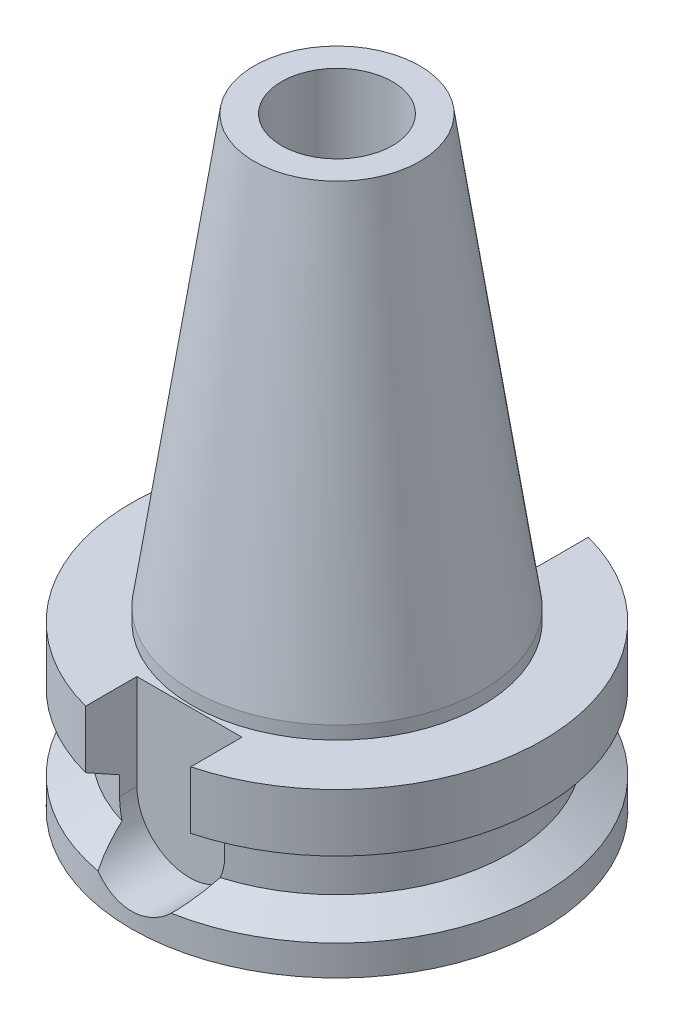
ISO-10303-21;
HEADER;
FILE_DESCRIPTION(('STEP AP214'),'2;1');
FILE_NAME('part.step','',(''),(''),'','','');
FILE_SCHEMA(('AUTOMOTIVE_DESIGN { 1 0 10303 214 1 1 1 1 }'));
ENDSEC;
DATA;
#1=APPLICATION_CONTEXT('core data for automotive mechanical design processes');
#2=APPLICATION_PROTOCOL_DEFINITION('international standard','automotive_design',2000,#1);
#3=PRODUCT_CONTEXT('',#1,'mechanical');
#4=PRODUCT('Part','Part','',(#3));
#5=PRODUCT_RELATED_PRODUCT_CATEGORY('part','',(#4));
#6=PRODUCT_DEFINITION_FORMATION('','',#4);
#7=PRODUCT_DEFINITION_CONTEXT('part definition',#1,'design');
#8=PRODUCT_DEFINITION('design','',#6,#7);
#9=PRODUCT_DEFINITION_SHAPE('','',#8);
#10=(LENGTH_UNIT() NAMED_UNIT(*) SI_UNIT(.MILLI.,.METRE.));
#11=(NAMED_UNIT(*) PLANE_ANGLE_UNIT() SI_UNIT($,.RADIAN.));
#12=(NAMED_UNIT(*) SI_UNIT($,.STERADIAN.) SOLID_ANGLE_UNIT());
#13=UNCERTAINTY_MEASURE_WITH_UNIT(LENGTH_MEASURE(1.E-05),#10,'distance_accuracy_value','');
#14=(GEOMETRIC_REPRESENTATION_CONTEXT(3) GLOBAL_UNCERTAINTY_ASSIGNED_CONTEXT((#13)) GLOBAL_UNIT_ASSIGNED_CONTEXT((#10,
#11,#12)) REPRESENTATION_CONTEXT('',''));
#15=CARTESIAN_POINT('',(0.,0.,0.));
#16=DIRECTION('',(0.,0.,1.));
#17=DIRECTION('',(1.,0.,0.));
#18=AXIS2_PLACEMENT_3D('',#15,#16,#17);
#19=CARTESIAN_POINT('',(0.,0.,0.));
#20=DIRECTION('',(0.,1.,0.));
#21=DIRECTION('',(0.,0.,1.));
#22=AXIS2_PLACEMENT_3D('',#19,#20,#21);
#23=PLANE('',#22);
#24=CARTESIAN_POINT('',(0.,0.,0.));
#25=DIRECTION('',(0.,-1.,0.));
#26=DIRECTION('',(0.,0.,-1.));
#27=AXIS2_PLACEMENT_3D('',#24,#25,#26);
#28=CIRCLE('',#27,31.5);
#29=CARTESIAN_POINT('',(0.,0.,-31.5));
#30=VERTEX_POINT('',#29);
#31=EDGE_CURVE('E19',#30,#30,#28,.F.);
#32=ORIENTED_EDGE('',*,*,#31,.F.);
#33=EDGE_LOOP('',(#32));
#34=FACE_BOUND('',#33,.T.);
#35=ADVANCED_FACE('F16',(#34),#23,.F.);
#36=CARTESIAN_POINT('',(0.,32.3999999999387,0.));
#37=DIRECTION('',(0.,1.,0.));
#38=DIRECTION('',(0.,0.,1.));
#39=AXIS2_PLACEMENT_3D('',#36,#37,#38);
#40=CONICAL_SURFACE('',#39,6.99999999983447,1.02974425861886);
#41=CARTESIAN_POINT('',(0.,28.1939756666248,-1.13686837721616E-10));
#42=VERTEX_POINT('',#41);
#43=VERTEX_LOOP('',#42);
#44=FACE_BOUND('',#43,.T.);
#45=CARTESIAN_POINT('',(0.,32.4,0.));
#46=DIRECTION('',(0.,1.,0.));
#47=DIRECTION('',(0.,0.,1.));
#48=AXIS2_PLACEMENT_3D('',#45,#46,#47);
#49=CIRCLE('',#48,7.);
#50=CARTESIAN_POINT('',(0.,32.4,7.));
#51=VERTEX_POINT('',#50);
#52=EDGE_CURVE('E144',#51,#51,#49,.T.);
#53=ORIENTED_EDGE('',*,*,#52,.T.);
#54=EDGE_LOOP('',(#53));
#55=FACE_BOUND('',#54,.T.);
#56=ADVANCED_FACE('F605',(#44,#55),#40,.F.);
#57=CARTESIAN_POINT('',(0.,4.62649730810373,0.));
#58=DIRECTION('',(0.,-1.,0.));
#59=DIRECTION('',(1.,0.,0.));
#60=AXIS2_PLACEMENT_3D('',#57,#58,#59);
#61=CONICAL_SURFACE('',#60,31.5,1.0471975511966);
#62=CARTESIAN_POINT('',(-5.60973855599943,4.62649730810373,30.9964648521946));
#63=CARTESIAN_POINT('',(-5.72681124042605,4.74030140783159,30.7749507957577));
#64=CARTESIAN_POINT('',(-5.83815600292801,4.85536159674054,30.5511241418209));
#65=CARTESIAN_POINT('',(-6.05025666423359,5.08758336020434,30.0996802970382));
#66=CARTESIAN_POINT('',(-6.15101612567928,5.20474421210729,29.8720644115875));
#67=CARTESIAN_POINT('',(-6.34249496906087,5.44034656726903,29.4146721715419));
#68=CARTESIAN_POINT('',(-6.43325407997655,5.55878078740826,29.1849086142501));
#69=CARTESIAN_POINT('',(-6.6058999307666,5.79714897312225,28.7228306481119));
#70=CARTESIAN_POINT('',(-6.68778585047849,5.91708307619259,28.4905160056469));
#71=CARTESIAN_POINT('',(-6.92097782113201,6.27871891190494,27.790611245737));
#72=CARTESIAN_POINT('',(-7.05990627777895,6.52236454896054,27.3198459390192));
#73=CARTESIAN_POINT('',(-7.24638617499865,6.89123698262056,26.6085548519541));
#74=CARTESIAN_POINT('',(-7.30499599697218,7.01503094389633,26.3700836788249));
#75=CARTESIAN_POINT('',(-7.41507227415004,7.26349758881578,25.891977834823));
#76=CARTESIAN_POINT('',(-7.46653932261877,7.38817019857578,25.652343262293));
#77=CARTESIAN_POINT('',(-7.5145969064659,7.5132486540519,25.4122181899443));
#78=B_SPLINE_CURVE_WITH_KNOTS('',3,(#62,#63,#64,#65,#66,#67,#68,#69,#70,#71,#72,#73,#74,#75,#76,
#77),.UNSPECIFIED.,.F.,.F.,(4,2,2,2,2,2,2,4),(0.,0.825395832960468,1.65051297051671,
2.47222397869766,3.29401087419913,4.93681588506406,5.76176421106182,6.58664397745267),.UNSPECIFIED.);
#79=CARTESIAN_POINT('',(-5.60973855599943,4.62649730810373,30.9964648521946));
#80=VERTEX_POINT('',#79);
#81=CARTESIAN_POINT('',(-7.5145969064659,7.5132486540519,25.4122181899443));
#82=VERTEX_POINT('',#81);
#83=EDGE_CURVE('E147',#80,#82,#78,.T.);
#84=ORIENTED_EDGE('',*,*,#83,.T.);
#85=CARTESIAN_POINT('',(0.,7.5132486540519,0.));
#86=DIRECTION('',(0.,1.,0.));
#87=DIRECTION('',(0.,0.,1.));
#88=AXIS2_PLACEMENT_3D('',#85,#86,#87);
#89=CIRCLE('',#88,26.5);
#90=CARTESIAN_POINT('',(-7.51459690646589,7.5132486540519,-25.4122181899443));
#91=VERTEX_POINT('',#90);
#92=EDGE_CURVE('E130',#91,#82,#89,.T.);
#93=ORIENTED_EDGE('',*,*,#92,.F.);
#94=CARTESIAN_POINT('',(-7.5145969064659,7.51324865405189,-25.4122181899443));
#95=CARTESIAN_POINT('',(-7.46653932261877,7.38817019857578,-25.652343262293));
#96=CARTESIAN_POINT('',(-7.41507227415004,7.26349758881578,-25.891977834823));
#97=CARTESIAN_POINT('',(-7.30499599697218,7.01503094389633,-26.3700836788249));
#98=CARTESIAN_POINT('',(-7.24638617499865,6.89123698262056,-26.6085548519541));
#99=CARTESIAN_POINT('',(-7.05990627777895,6.52236454896055,-27.3198459390192));
#100=CARTESIAN_POINT('',(-6.92097782113201,6.27871891190495,-27.790611245737));
#101=CARTESIAN_POINT('',(-6.6877858504785,5.9170830761926,-28.4905160056469));
#102=CARTESIAN_POINT('',(-6.60589993076661,5.79714897312226,-28.7228306481119));
#103=CARTESIAN_POINT('',(-6.43325407997656,5.55878078740827,-29.18490861425));
#104=CARTESIAN_POINT('',(-6.34249496906088,5.44034656726904,-29.4146721715419));
#105=CARTESIAN_POINT('',(-6.15101612567929,5.20474421210731,-29.8720644115875));
#106=CARTESIAN_POINT('',(-6.0502566642336,5.08758336020436,-30.0996802970382));
#107=CARTESIAN_POINT('',(-5.83815600292802,4.85536159674055,-30.5511241418208));
#108=CARTESIAN_POINT('',(-5.72681124042606,4.7403014078316,-30.7749507957577));
#109=CARTESIAN_POINT('',(-5.60973855599943,4.62649730810373,-30.9964648521946));
#110=B_SPLINE_CURVE_WITH_KNOTS('',3,(#94,#95,#96,#97,#98,#99,#100,#101,#102,#103,#104,#105,#106,
#107,#108,#109),.UNSPECIFIED.,.F.,.F.,(4,2,2,2,2,2,2,4),(0.,0.82487976639084,1.6498280923886,
3.29263310325352,4.11441999875499,4.93613100693593,5.76124814449217,6.58664397745263),.UNSPECIFIED.);
#111=CARTESIAN_POINT('',(-5.60973855599943,4.62649730810373,-30.9964648521946));
#112=VERTEX_POINT('',#111);
#113=EDGE_CURVE('E214',#91,#112,#110,.T.);
#114=ORIENTED_EDGE('',*,*,#113,.T.);
#115=CARTESIAN_POINT('',(0.,4.62649730810373,0.));
#116=DIRECTION('',(0.,-1.,0.));
#117=DIRECTION('',(0.,0.,-1.));
#118=AXIS2_PLACEMENT_3D('',#115,#116,#117);
#119=CIRCLE('',#118,31.5);
#120=EDGE_CURVE('E150',#80,#112,#119,.T.);
#121=ORIENTED_EDGE('',*,*,#120,.F.);
#122=EDGE_LOOP('',(#84,#93,#114,#121));
#123=FACE_BOUND('',#122,.T.);
#124=ADVANCED_FACE('F148',(#123),#61,.T.);
#125=CARTESIAN_POINT('',(0.,25.,0.));
#126=DIRECTION('',(0.,-1.,0.));
#127=DIRECTION('',(0.,0.,-1.));
#128=AXIS2_PLACEMENT_3D('',#125,#126,#127);
#129=CYLINDRICAL_SURFACE('',#128,31.5);
#130=ORIENTED_EDGE('',*,*,#31,.T.);
#131=EDGE_LOOP('',(#130));
#132=FACE_BOUND('',#131,.T.);
#133=CARTESIAN_POINT('',(-5.60973855599943,4.62649730810373,-30.9964648521946));
#134=CARTESIAN_POINT('',(-5.44871815422803,4.47001893251374,-31.025613918967));
#135=CARTESIAN_POINT('',(-5.28111407042333,4.32029096171837,-31.0546441105057));
#136=CARTESIAN_POINT('',(-4.93386444338326,4.03526393431006,-31.1116989857738));
#137=CARTESIAN_POINT('',(-4.75421753985964,3.89996651217697,-31.1397235553631));
#138=CARTESIAN_POINT('',(-4.38354639547712,3.6444206867389,-31.1940656015174));
#139=CARTESIAN_POINT('',(-4.19249280135721,3.52421381732211,-31.2203782746166));
#140=CARTESIAN_POINT('',(-3.80073012093028,3.30015069386667,-31.270488156572));
#141=CARTESIAN_POINT('',(-3.600021833486,3.19629309006109,-31.29428557303));
#142=CARTESIAN_POINT('',(-3.18999517894756,3.00556767652188,-31.3387382167334));
#143=CARTESIAN_POINT('',(-2.98066484940386,2.91872450467017,-31.3593888778249));
#144=CARTESIAN_POINT('',(-2.55512922400664,2.76290971138469,-31.3969254178638));
#145=CARTESIAN_POINT('',(-2.33892414777428,2.69393751968596,-31.4138114169396));
#146=CARTESIAN_POINT('',(-1.90185581810324,2.57461741844016,-31.4432946704784));
#147=CARTESIAN_POINT('',(-1.68100856573534,2.52421401018572,-31.4559046959083));
#148=CARTESIAN_POINT('',(-1.23573803999673,2.44219545343608,-31.476539951397));
#149=CARTESIAN_POINT('',(-1.01131680520927,2.41056996229045,-31.4845677052215));
#150=CARTESIAN_POINT('',(-0.655404383856251,2.37565168946506,-31.493452186862));
#151=CARTESIAN_POINT('',(-0.524540773532398,2.36603662608804,-31.495904959492));
#152=CARTESIAN_POINT('',(-0.262456719428797,2.35320981736267,-31.4991792530609));
#153=CARTESIAN_POINT('',(-0.131236218112395,2.34999917434277,-31.5000004931805));
#154=CARTESIAN_POINT('',(0.221971606600001,2.35000139650826,-31.4999991658396));
#155=CARTESIAN_POINT('',(0.443988175803804,2.35919016134746,-31.4976475173771));
#156=CARTESIAN_POINT('',(0.886496265839256,2.39587882663232,-31.4883017982448));
#157=CARTESIAN_POINT('',(1.10698692806337,2.42338830419687,-31.4813052994942));
#158=CARTESIAN_POINT('',(1.54517639633839,2.49656037804462,-31.4628447854053));
#159=CARTESIAN_POINT('',(1.76286917756572,2.54225698916746,-31.4513723997506));
#160=CARTESIAN_POINT('',(2.19358416232798,2.65144694215402,-31.4242705551043));
#161=CARTESIAN_POINT('',(2.40660412934934,2.71494861381766,-31.4086391505606));
#162=CARTESIAN_POINT('',(2.82611258534185,2.85913020328454,-31.3736726565847));
#163=CARTESIAN_POINT('',(3.03260939023354,2.93978714463264,-31.3543425243871));
#164=CARTESIAN_POINT('',(3.43789158578475,3.11766839625262,-31.3124957325703));
#165=CARTESIAN_POINT('',(3.63668033903535,3.21488538017104,-31.2899804828274));
#166=CARTESIAN_POINT('',(4.02509690177095,3.425059197045,-31.2423884924315));
#167=CARTESIAN_POINT('',(4.21473594403957,3.53799603312794,-31.2173150166928));
#168=CARTESIAN_POINT('',(4.58385176709607,3.7788717526153,-31.1652534964627));
#169=CARTESIAN_POINT('',(4.76333305554572,3.90680390297057,-31.1382663133793));
#170=CARTESIAN_POINT('',(5.05470816956819,4.13305717390121,-31.0920262272703));
#171=CARTESIAN_POINT('',(5.1696572470484,4.22754043005529,-31.0731007960765));
#172=CARTESIAN_POINT('',(5.39393063793946,4.42253730501998,-31.0349551309629));
#173=CARTESIAN_POINT('',(5.50326394608432,4.52304068406523,-31.0157354368195));
#174=CARTESIAN_POINT('',(5.60973855599943,4.62649730810373,-30.9964648521946));
#175=B_SPLINE_CURVE_WITH_KNOTS('',3,(#133,#134,#135,#136,#137,#138,#139,#140,#141,#142,#143,
#144,#145,#146,#147,#148,#149,#150,#151,#152,#153,#154,#155,#156,#157,#158,#159,#160,#161,#162,
#163,#164,#165,#166,#167,#168,#169,#170,#171,#172,#173,#174),.UNSPECIFIED.,.F.,.F.,(4,2,2,2,2,2,
2,2,2,2,2,2,2,2,2,2,2,2,2,2,4),(0.,0.679046788962342,1.35817040884096,2.03912401352552,
2.72002137034743,3.40189753448587,4.08375193719937,4.76355154238112,5.44297637396773,
5.83654399863496,6.23017935829458,6.89597020822127,7.56210937256566,8.22950029564581,
8.89720396887246,9.56401893957908,10.2305396662417,10.8962201464296,11.5616028660952,
12.0113762065729,12.4604051208954),.UNSPECIFIED.);
#176=CARTESIAN_POINT('',(5.60973855599943,4.62649730810373,-30.9964648521946));
#177=VERTEX_POINT('',#176);
#178=EDGE_CURVE('E229',#112,#177,#175,.T.);
#179=ORIENTED_EDGE('',*,*,#178,.T.);
#180=CARTESIAN_POINT('',(0.,4.62649730810373,0.));
#181=DIRECTION('',(0.,-1.,0.));
#182=DIRECTION('',(0.,0.,-1.));
#183=AXIS2_PLACEMENT_3D('',#180,#181,#182);
#184=CIRCLE('',#183,31.5);
#185=CARTESIAN_POINT('',(5.60973855599943,4.62649730810373,30.9964648521946));
#186=VERTEX_POINT('',#185);
#187=EDGE_CURVE('E410',#186,#177,#184,.F.);
#188=ORIENTED_EDGE('',*,*,#187,.F.);
#189=CARTESIAN_POINT('',(5.60973855599943,4.62649730810373,30.9964648521946));
#190=CARTESIAN_POINT('',(5.44871815422803,4.47001893251374,31.025613918967));
#191=CARTESIAN_POINT('',(5.28111407042333,4.32029096171837,31.0546441105057));
#192=CARTESIAN_POINT('',(4.93386444338326,4.03526393431006,31.1116989857738));
#193=CARTESIAN_POINT('',(4.75421753985963,3.89996651217696,31.1397235553631));
#194=CARTESIAN_POINT('',(4.38354639547711,3.6444206867389,31.1940656015174));
#195=CARTESIAN_POINT('',(4.1924928013572,3.52421381732211,31.2203782746166));
#196=CARTESIAN_POINT('',(3.80073012093028,3.30015069386667,31.270488156572));
#197=CARTESIAN_POINT('',(3.600021833486,3.19629309006109,31.29428557303));
#198=CARTESIAN_POINT('',(3.18999517894756,3.00556767652188,31.3387382167334));
#199=CARTESIAN_POINT('',(2.98066484940386,2.91872450467016,31.3593888778249));
#200=CARTESIAN_POINT('',(2.55512922400664,2.76290971138469,31.3969254178638));
#201=CARTESIAN_POINT('',(2.33892414777428,2.69393751968596,31.4138114169396));
#202=CARTESIAN_POINT('',(1.90185581810324,2.57461741844016,31.4432946704784));
#203=CARTESIAN_POINT('',(1.68100856573534,2.52421401018572,31.4559046959083));
#204=CARTESIAN_POINT('',(1.23573803999672,2.44219545343608,31.476539951397));
#205=CARTESIAN_POINT('',(1.01131680520927,2.41056996229046,31.4845677052215));
#206=CARTESIAN_POINT('',(0.655404383856248,2.37565168946507,31.493452186862));
#207=CARTESIAN_POINT('',(0.524540773532396,2.36603662608804,31.495904959492));
#208=CARTESIAN_POINT('',(0.262456719428796,2.35320981736267,31.4991792530609));
#209=CARTESIAN_POINT('',(0.131236218112395,2.34999917434277,31.5000004931805));
#210=CARTESIAN_POINT('',(-0.2219716066,2.35000139650826,31.4999991658396));
#211=CARTESIAN_POINT('',(-0.443988175803803,2.35919016134747,31.4976475173771));
#212=CARTESIAN_POINT('',(-0.886496265839253,2.39587882663232,31.4883017982448));
#213=CARTESIAN_POINT('',(-1.10698692806337,2.42338830419686,31.4813052994942));
#214=CARTESIAN_POINT('',(-1.54517639633839,2.49656037804462,31.4628447854053));
#215=CARTESIAN_POINT('',(-1.76286917756572,2.54225698916746,31.4513723997506));
#216=CARTESIAN_POINT('',(-2.19358416232798,2.65144694215402,31.4242705551043));
#217=CARTESIAN_POINT('',(-2.40660412934934,2.71494861381767,31.4086391505606));
#218=CARTESIAN_POINT('',(-2.82611258534184,2.85913020328454,31.3736726565847));
#219=CARTESIAN_POINT('',(-3.03260939023353,2.93978714463264,31.3543425243871));
#220=CARTESIAN_POINT('',(-3.43789158578475,3.11766839625262,31.3124957325703));
#221=CARTESIAN_POINT('',(-3.63668033903535,3.21488538017104,31.2899804828274));
#222=CARTESIAN_POINT('',(-4.02509690177095,3.425059197045,31.2423884924315));
#223=CARTESIAN_POINT('',(-4.21473594403957,3.53799603312794,31.2173150166928));
#224=CARTESIAN_POINT('',(-4.58385176709607,3.7788717526153,31.1652534964627));
#225=CARTESIAN_POINT('',(-4.76333305554572,3.90680390297058,31.1382663133793));
#226=CARTESIAN_POINT('',(-5.05470816956819,4.13305717390121,31.0920262272703));
#227=CARTESIAN_POINT('',(-5.1696572470484,4.22754043005529,31.0731007960765));
#228=CARTESIAN_POINT('',(-5.39393063793946,4.42253730501998,31.0349551309629));
#229=CARTESIAN_POINT('',(-5.50326394608433,4.52304068406523,31.0157354368195));
#230=CARTESIAN_POINT('',(-5.60973855599943,4.62649730810373,30.9964648521946));
#231=B_SPLINE_CURVE_WITH_KNOTS('',3,(#189,#190,#191,#192,#193,#194,#195,#196,#197,#198,#199,
#200,#201,#202,#203,#204,#205,#206,#207,#208,#209,#210,#211,#212,#213,#214,#215,#216,#217,#218,
#219,#220,#221,#222,#223,#224,#225,#226,#227,#228,#229,#230),.UNSPECIFIED.,.F.,.F.,(4,2,2,2,2,2,
2,2,2,2,2,2,2,2,2,2,2,2,2,2,4),(0.,0.679046788962344,1.35817040884096,2.03912401352552,
2.72002137034743,3.40189753448588,4.08375193719937,4.76355154238112,5.44297637396774,
5.83654399863497,6.23017935829458,6.89597020822127,7.56210937256566,8.22950029564581,
8.89720396887246,9.56401893957908,10.2305396662417,10.8962201464296,11.5616028660952,
12.0113762065729,12.4604051208954),.UNSPECIFIED.);
#232=EDGE_CURVE('E154',#186,#80,#231,.T.);
#233=ORIENTED_EDGE('',*,*,#232,.T.);
#234=ORIENTED_EDGE('',*,*,#120,.T.);
#235=EDGE_LOOP('',(#179,#188,#233,#234));
#236=FACE_BOUND('',#235,.T.);
#237=ADVANCED_FACE('F239',(#132,#236),#129,.T.);
#238=CARTESIAN_POINT('',(0.,4.62649730810373,0.));
#239=DIRECTION('',(0.,-1.,0.));
#240=DIRECTION('',(1.,0.,0.));
#241=AXIS2_PLACEMENT_3D('',#238,#239,#240);
#242=CONICAL_SURFACE('',#241,31.5,1.0471975511966);
#243=CARTESIAN_POINT('',(7.5145969064659,7.5132486540519,25.4122181899443));
#244=CARTESIAN_POINT('',(7.46653932261877,7.38817019857578,25.652343262293));
#245=CARTESIAN_POINT('',(7.41507227415004,7.26349758881578,25.891977834823));
#246=CARTESIAN_POINT('',(7.30499599697218,7.01503094389633,26.3700836788249));
#247=CARTESIAN_POINT('',(7.24638617499865,6.89123698262056,26.6085548519541));
#248=CARTESIAN_POINT('',(7.05990627777895,6.52236454896055,27.3198459390192));
#249=CARTESIAN_POINT('',(6.92097782113202,6.27871891190495,27.790611245737));
#250=CARTESIAN_POINT('',(6.6877858504785,5.9170830761926,28.4905160056469));
#251=CARTESIAN_POINT('',(6.60589993076661,5.79714897312226,28.7228306481119));
#252=CARTESIAN_POINT('',(6.43325407997656,5.55878078740827,29.18490861425));
#253=CARTESIAN_POINT('',(6.34249496906088,5.44034656726905,29.4146721715419));
#254=CARTESIAN_POINT('',(6.15101612567929,5.20474421210731,29.8720644115875));
#255=CARTESIAN_POINT('',(6.0502566642336,5.08758336020436,30.0996802970382));
#256=CARTESIAN_POINT('',(5.83815600292802,4.85536159674055,30.5511241418208));
#257=CARTESIAN_POINT('',(5.72681124042606,4.7403014078316,30.7749507957577));
#258=CARTESIAN_POINT('',(5.60973855599943,4.62649730810373,30.9964648521946));
#259=B_SPLINE_CURVE_WITH_KNOTS('',3,(#243,#244,#245,#246,#247,#248,#249,#250,#251,#252,#253,
#254,#255,#256,#257,#258),.UNSPECIFIED.,.F.,.F.,(4,2,2,2,2,2,2,4),(0.,0.824879766390844,
1.6498280923886,3.29263310325352,4.11441999875499,4.93613100693593,5.76124814449217,
6.58664397745263),.UNSPECIFIED.);
#260=CARTESIAN_POINT('',(7.5145969064659,7.5132486540519,25.4122181899443));
#261=VERTEX_POINT('',#260);
#262=EDGE_CURVE('E160',#261,#186,#259,.T.);
#263=ORIENTED_EDGE('',*,*,#262,.T.);
#264=ORIENTED_EDGE('',*,*,#187,.T.);
#265=CARTESIAN_POINT('',(5.60973855599943,4.62649730810373,-30.9964648521946));
#266=CARTESIAN_POINT('',(5.72681124042605,4.74030140783159,-30.7749507957577));
#267=CARTESIAN_POINT('',(5.83815600292801,4.85536159674054,-30.5511241418209));
#268=CARTESIAN_POINT('',(6.05025666423359,5.08758336020434,-30.0996802970382));
#269=CARTESIAN_POINT('',(6.15101612567928,5.20474421210729,-29.8720644115875));
#270=CARTESIAN_POINT('',(6.34249496906087,5.44034656726903,-29.4146721715419));
#271=CARTESIAN_POINT('',(6.43325407997655,5.55878078740826,-29.1849086142501));
#272=CARTESIAN_POINT('',(6.6058999307666,5.79714897312225,-28.7228306481119));
#273=CARTESIAN_POINT('',(6.68778585047849,5.91708307619259,-28.4905160056469));
#274=CARTESIAN_POINT('',(6.92097782113201,6.27871891190494,-27.790611245737));
#275=CARTESIAN_POINT('',(7.05990627777895,6.52236454896054,-27.3198459390192));
#276=CARTESIAN_POINT('',(7.24638617499865,6.89123698262056,-26.6085548519541));
#277=CARTESIAN_POINT('',(7.30499599697218,7.01503094389633,-26.3700836788249));
#278=CARTESIAN_POINT('',(7.41507227415004,7.26349758881578,-25.891977834823));
#279=CARTESIAN_POINT('',(7.46653932261877,7.38817019857578,-25.652343262293));
#280=CARTESIAN_POINT('',(7.5145969064659,7.5132486540519,-25.4122181899443));
#281=B_SPLINE_CURVE_WITH_KNOTS('',3,(#265,#266,#267,#268,#269,#270,#271,#272,#273,#274,#275,
#276,#277,#278,#279,#280),.UNSPECIFIED.,.F.,.F.,(4,2,2,2,2,2,2,4),(0.,0.825395832960468,
1.65051297051671,2.47222397869766,3.29401087419914,4.93681588506406,5.76176421106183,
6.58664397745267),.UNSPECIFIED.);
#282=CARTESIAN_POINT('',(7.51459690646589,7.51324865405189,-25.4122181899443));
#283=VERTEX_POINT('',#282);
#284=EDGE_CURVE('E224',#177,#283,#281,.T.);
#285=ORIENTED_EDGE('',*,*,#284,.T.);
#286=CARTESIAN_POINT('',(0.,7.5132486540519,0.));
#287=DIRECTION('',(0.,1.,0.));
#288=DIRECTION('',(0.,0.,1.));
#289=AXIS2_PLACEMENT_3D('',#286,#287,#288);
#290=CIRCLE('',#289,26.5);
#291=EDGE_CURVE('E260',#261,#283,#290,.T.);
#292=ORIENTED_EDGE('',*,*,#291,.F.);
#293=EDGE_LOOP('',(#263,#264,#285,#292));
#294=FACE_BOUND('',#293,.T.);
#295=ADVANCED_FACE('F235',(#294),#242,.T.);
#296=CARTESIAN_POINT('',(0.,92.4,0.));
#297=DIRECTION('',(0.,1.,0.));
#298=DIRECTION('',(0.,0.,1.));
#299=AXIS2_PLACEMENT_3D('',#296,#297,#298);
#300=CYLINDRICAL_SURFACE('',#299,7.);
#301=ORIENTED_EDGE('',*,*,#52,.F.);
#302=EDGE_LOOP('',(#301));
#303=FACE_BOUND('',#302,.T.);
#304=CARTESIAN_POINT('',(0.,72.4,0.));
#305=DIRECTION('',(0.,1.,0.));
#306=DIRECTION('',(0.,0.,1.));
#307=AXIS2_PLACEMENT_3D('',#304,#305,#306);
#308=CIRCLE('',#307,7.);
#309=CARTESIAN_POINT('',(0.,72.4,7.));
#310=VERTEX_POINT('',#309);
#311=EDGE_CURVE('E193',#310,#310,#308,.F.);
#312=ORIENTED_EDGE('',*,*,#311,.F.);
#313=EDGE_LOOP('',(#312));
#314=FACE_BOUND('',#313,.T.);
#315=ADVANCED_FACE('F238',(#303,#314),#300,.F.);
#316=CARTESIAN_POINT('',(0.,16.1735026918962,0.));
#317=DIRECTION('',(0.,1.,0.));
#318=DIRECTION('',(0.,0.,1.));
#319=AXIS2_PLACEMENT_3D('',#316,#317,#318);
#320=CONICAL_SURFACE('',#319,31.5,1.0471975511966);
#321=CARTESIAN_POINT('',(-8.05,16.1735026918962,30.4540227227866));
#322=CARTESIAN_POINT('',(-8.05,15.9317144765931,30.0208448831275));
#323=CARTESIAN_POINT('',(-8.05,15.6901792202045,29.5875257205554));
#324=CARTESIAN_POINT('',(-8.05,15.2076923592774,28.7205639494852));
#325=CARTESIAN_POINT('',(-8.05,14.9667407533535,28.2869213417581));
#326=CARTESIAN_POINT('',(-8.05,14.485497641654,27.4192695769931));
#327=CARTESIAN_POINT('',(-8.05,14.2452061362513,26.9852604197483));
#328=CARTESIAN_POINT('',(-8.05,13.7653833187316,26.116820779408));
#329=CARTESIAN_POINT('',(-8.05,13.5258520084244,25.6823902953125));
#330=CARTESIAN_POINT('',(-8.05,13.2867513459481,25.2477226695796));
#331=B_SPLINE_CURVE_WITH_KNOTS('',3,(#321,#322,#323,#324,#325,#326,#327,#328,#329,#330),
.UNSPECIFIED.,.F.,.F.,(4,2,2,2,4),(0.,1.48826793916399,2.97653234194075,4.46479758543794,
5.95306636975733),.UNSPECIFIED.);
#332=CARTESIAN_POINT('',(-8.05,16.1735026918962,30.4540227227866));
#333=VERTEX_POINT('',#332);
#334=CARTESIAN_POINT('',(-8.05,13.2867513459481,25.2477226695796));
#335=VERTEX_POINT('',#334);
#336=EDGE_CURVE('E346',#333,#335,#331,.T.);
#337=ORIENTED_EDGE('',*,*,#336,.F.);
#338=CARTESIAN_POINT('',(0.,16.1735026918962,0.));
#339=DIRECTION('',(0.,-1.,0.));
#340=DIRECTION('',(0.,0.,-1.));
#341=AXIS2_PLACEMENT_3D('',#338,#339,#340);
#342=CIRCLE('',#341,31.5);
#343=CARTESIAN_POINT('',(-8.05,16.1735026918962,-30.4540227227866));
#344=VERTEX_POINT('',#343);
#345=EDGE_CURVE('E408',#344,#333,#342,.F.);
#346=ORIENTED_EDGE('',*,*,#345,.F.);
#347=CARTESIAN_POINT('',(-8.05,16.1735026918962,-30.4540227227866));
#348=CARTESIAN_POINT('',(-8.05,15.9317144765931,-30.0208448831275));
#349=CARTESIAN_POINT('',(-8.05,15.6901792202045,-29.5875257205554));
#350=CARTESIAN_POINT('',(-8.05,15.2076923592774,-28.7205639494852));
#351=CARTESIAN_POINT('',(-8.05,14.9667407533535,-28.2869213417581));
#352=CARTESIAN_POINT('',(-8.05,14.485497641654,-27.4192695769931));
#353=CARTESIAN_POINT('',(-8.05,14.2452061362513,-26.9852604197483));
#354=CARTESIAN_POINT('',(-8.05,13.7653833187316,-26.116820779408));
#355=CARTESIAN_POINT('',(-8.05,13.5258520084245,-25.6823902953125));
#356=CARTESIAN_POINT('',(-8.05,13.2867513459481,-25.2477226695796));
#357=B_SPLINE_CURVE_WITH_KNOTS('',3,(#347,#348,#349,#350,#351,#352,#353,#354,#355,#356),
.UNSPECIFIED.,.F.,.F.,(4,2,2,2,4),(0.,1.48826793916399,2.97653234194074,4.46479758543792,
5.95306636975732),.UNSPECIFIED.);
#358=CARTESIAN_POINT('',(-8.05,13.2867513459481,-25.2477226695796));
#359=VERTEX_POINT('',#358);
#360=EDGE_CURVE('E354',#344,#359,#357,.T.);
#361=ORIENTED_EDGE('',*,*,#360,.T.);
#362=CARTESIAN_POINT('',(0.,13.2867513459481,0.));
#363=DIRECTION('',(0.,1.,0.));
#364=DIRECTION('',(0.,0.,1.));
#365=AXIS2_PLACEMENT_3D('',#362,#363,#364);
#366=CIRCLE('',#365,26.5);
#367=EDGE_CURVE('E143',#335,#359,#366,.F.);
#368=ORIENTED_EDGE('',*,*,#367,.F.);
#369=EDGE_LOOP('',(#337,#346,#361,#368));
#370=FACE_BOUND('',#369,.T.);
#371=ADVANCED_FACE('F181',(#370),#320,.T.);
#372=CARTESIAN_POINT('',(0.,92.4,0.));
#373=DIRECTION('',(0.,1.,0.));
#374=DIRECTION('',(0.,0.,1.));
#375=AXIS2_PLACEMENT_3D('',#372,#373,#374);
#376=CYLINDRICAL_SURFACE('',#375,26.5);
#377=ORIENTED_EDGE('',*,*,#367,.T.);
#378=DIRECTION('',(0.,-1.,0.));
#379=VECTOR('',#378,1.);
#380=CARTESIAN_POINT('',(-8.05,10.4,-25.2477226695796));
#381=LINE('',#380,#379);
#382=CARTESIAN_POINT('',(-8.05,10.4,-25.2477226695796));
#383=VERTEX_POINT('',#382);
#384=EDGE_CURVE('E359',#359,#383,#381,.T.);
#385=ORIENTED_EDGE('',*,*,#384,.T.);
#386=CARTESIAN_POINT('',(-8.05,10.4,-25.2477226695796));
#387=CARTESIAN_POINT('',(-8.05004429299833,10.1523246036443,-25.2476751719018));
#388=CARTESIAN_POINT('',(-8.03857029485708,9.90466880620693,-25.251367050694));
#389=CARTESIAN_POINT('',(-7.99312744879042,9.41388740379616,-25.2658048800295));
#390=CARTESIAN_POINT('',(-7.95936216324248,9.17074108665377,-25.2764869886344));
#391=CARTESIAN_POINT('',(-7.86986726556857,8.6889365346375,-25.3044925959902));
#392=CARTESIAN_POINT('',(-7.81413856871144,8.45027811317622,-25.321815817989));
#393=CARTESIAN_POINT('',(-7.68077170830125,7.97733545981082,-25.3625777416334));
#394=CARTESIAN_POINT('',(-7.60293898909753,7.74311071058049,-25.3860706025353));
#395=CARTESIAN_POINT('',(-7.5145969064659,7.51324865405189,-25.4122181899443));
#396=B_SPLINE_CURVE_WITH_KNOTS('',3,(#386,#387,#388,#389,#390,#391,#392,#393,#394,#395),
.UNSPECIFIED.,.F.,.F.,(4,2,2,2,4),(0.,0.742702465231211,1.47871474112466,2.21469634883646,
2.95736814751846),.UNSPECIFIED.);
#397=EDGE_CURVE('E139',#383,#91,#396,.T.);
#398=ORIENTED_EDGE('',*,*,#397,.T.);
#399=ORIENTED_EDGE('',*,*,#92,.T.);
#400=CARTESIAN_POINT('',(-7.5145969064659,7.51324865405189,25.4122181899443));
#401=CARTESIAN_POINT('',(-7.60293898909753,7.74311071058049,25.3860706025353));
#402=CARTESIAN_POINT('',(-7.68077170830125,7.97733545981082,25.3625777416334));
#403=CARTESIAN_POINT('',(-7.81413856871144,8.45027811317622,25.321815817989));
#404=CARTESIAN_POINT('',(-7.86986726556857,8.6889365346375,25.3044925959902));
#405=CARTESIAN_POINT('',(-7.95936216324248,9.17074108665377,25.2764869886344));
#406=CARTESIAN_POINT('',(-7.99312744879042,9.41388740379616,25.2658048800295));
#407=CARTESIAN_POINT('',(-8.03857029485708,9.90466880620693,25.251367050694));
#408=CARTESIAN_POINT('',(-8.05004429299833,10.1523246036443,25.2476751719018));
#409=CARTESIAN_POINT('',(-8.05,10.4,25.2477226695796));
#410=B_SPLINE_CURVE_WITH_KNOTS('',3,(#400,#401,#402,#403,#404,#405,#406,#407,#408,#409),
.UNSPECIFIED.,.F.,.F.,(4,2,2,2,4),(0.,0.742671798682007,1.47865340639381,2.21466568228725,
2.95736814751846),.UNSPECIFIED.);
#411=CARTESIAN_POINT('',(-8.05,10.4,25.2477226695796));
#412=VERTEX_POINT('',#411);
#413=EDGE_CURVE('E136',#82,#412,#410,.T.);
#414=ORIENTED_EDGE('',*,*,#413,.T.);
#415=DIRECTION('',(0.,1.,0.));
#416=VECTOR('',#415,1.);
#417=CARTESIAN_POINT('',(-8.05,10.4,25.2477226695796));
#418=LINE('',#417,#416);
#419=EDGE_CURVE('E352',#335,#412,#418,.F.);
#420=ORIENTED_EDGE('',*,*,#419,.F.);
#421=EDGE_LOOP('',(#377,#385,#398,#399,#414,#420));
#422=FACE_BOUND('',#421,.T.);
#423=ADVANCED_FACE('F133',(#422),#376,.T.);
#424=CARTESIAN_POINT('',(0.,10.4,31.5));
#425=DIRECTION('',(0.,0.,-1.));
#426=DIRECTION('',(-1.,0.,0.));
#427=AXIS2_PLACEMENT_3D('',#424,#425,#426);
#428=CYLINDRICAL_SURFACE('',#427,8.05);
#429=ORIENTED_EDGE('',*,*,#232,.F.);
#430=ORIENTED_EDGE('',*,*,#262,.F.);
#431=CARTESIAN_POINT('',(8.05,10.4,25.2477226695796));
#432=CARTESIAN_POINT('',(8.05004429299833,10.1523246036443,25.2476751719018));
#433=CARTESIAN_POINT('',(8.03857029485708,9.90466880620693,25.251367050694));
#434=CARTESIAN_POINT('',(7.99312744879042,9.41388740379616,25.2658048800295));
#435=CARTESIAN_POINT('',(7.95936216324248,9.17074108665378,25.2764869886344));
#436=CARTESIAN_POINT('',(7.86986726556857,8.6889365346375,25.3044925959902));
#437=CARTESIAN_POINT('',(7.81413856871144,8.45027811317622,25.321815817989));
#438=CARTESIAN_POINT('',(7.68077170830126,7.97733545981083,25.3625777416334));
#439=CARTESIAN_POINT('',(7.60293898909753,7.7431107105805,25.3860706025353));
#440=CARTESIAN_POINT('',(7.5145969064659,7.5132486540519,25.4122181899443));
#441=B_SPLINE_CURVE_WITH_KNOTS('',3,(#431,#432,#433,#434,#435,#436,#437,#438,#439,#440),
.UNSPECIFIED.,.F.,.F.,(4,2,2,2,4),(0.,0.742702465231209,1.47871474112465,2.21469634883645,
2.95736814751845),.UNSPECIFIED.);
#442=CARTESIAN_POINT('',(8.05,10.4,25.2477226695796));
#443=VERTEX_POINT('',#442);
#444=EDGE_CURVE('E153',#443,#261,#441,.T.);
#445=ORIENTED_EDGE('',*,*,#444,.F.);
#446=DIRECTION('',(0.,0.,1.));
#447=VECTOR('',#446,1.);
#448=CARTESIAN_POINT('',(8.05,10.4,31.5));
#449=LINE('',#448,#447);
#450=CARTESIAN_POINT('',(8.05,10.4,22.6));
#451=VERTEX_POINT('',#450);
#452=EDGE_CURVE('E403',#451,#443,#449,.T.);
#453=ORIENTED_EDGE('',*,*,#452,.F.);
#454=CARTESIAN_POINT('',(0.,10.4,22.6));
#455=DIRECTION('',(0.,0.,-1.));
#456=DIRECTION('',(-1.,0.,0.));
#457=AXIS2_PLACEMENT_3D('',#454,#455,#456);
#458=CIRCLE('',#457,8.05);
#459=CARTESIAN_POINT('',(-8.05,10.4,22.6));
#460=VERTEX_POINT('',#459);
#461=EDGE_CURVE('E329',#460,#451,#458,.F.);
#462=ORIENTED_EDGE('',*,*,#461,.F.);
#463=DIRECTION('',(0.,0.,1.));
#464=VECTOR('',#463,1.);
#465=CARTESIAN_POINT('',(-8.05,10.4,31.5));
#466=LINE('',#465,#464);
#467=EDGE_CURVE('E158',#412,#460,#466,.F.);
#468=ORIENTED_EDGE('',*,*,#467,.F.);
#469=ORIENTED_EDGE('',*,*,#413,.F.);
#470=ORIENTED_EDGE('',*,*,#83,.F.);
#471=EDGE_LOOP('',(#429,#430,#445,#453,#462,#468,#469,#470));
#472=FACE_BOUND('',#471,.T.);
#473=ADVANCED_FACE('F156',(#472),#428,.F.);
#474=CARTESIAN_POINT('',(0.,92.4,0.));
#475=DIRECTION('',(0.,1.,0.));
#476=DIRECTION('',(0.,0.,1.));
#477=AXIS2_PLACEMENT_3D('',#474,#475,#476);
#478=CYLINDRICAL_SURFACE('',#477,26.5);
#479=ORIENTED_EDGE('',*,*,#444,.T.);
#480=ORIENTED_EDGE('',*,*,#291,.T.);
#481=CARTESIAN_POINT('',(7.5145969064659,7.51324865405189,-25.4122181899443));
#482=CARTESIAN_POINT('',(7.60293898909753,7.74311071058049,-25.3860706025353));
#483=CARTESIAN_POINT('',(7.68077170830125,7.97733545981082,-25.3625777416334));
#484=CARTESIAN_POINT('',(7.81413856871144,8.45027811317622,-25.321815817989));
#485=CARTESIAN_POINT('',(7.86986726556857,8.6889365346375,-25.3044925959902));
#486=CARTESIAN_POINT('',(7.95936216324248,9.17074108665377,-25.2764869886344));
#487=CARTESIAN_POINT('',(7.99312744879042,9.41388740379616,-25.2658048800295));
#488=CARTESIAN_POINT('',(8.03857029485708,9.90466880620693,-25.251367050694));
#489=CARTESIAN_POINT('',(8.05004429299833,10.1523246036443,-25.2476751719018));
#490=CARTESIAN_POINT('',(8.05,10.4,-25.2477226695796));
#491=B_SPLINE_CURVE_WITH_KNOTS('',3,(#481,#482,#483,#484,#485,#486,#487,#488,#489,#490),
.UNSPECIFIED.,.F.,.F.,(4,2,2,2,4),(0.,0.742671798682007,1.47865340639381,2.21466568228725,
2.95736814751846),.UNSPECIFIED.);
#492=CARTESIAN_POINT('',(8.05,10.4,-25.2477226695796));
#493=VERTEX_POINT('',#492);
#494=EDGE_CURVE('E194',#283,#493,#491,.T.);
#495=ORIENTED_EDGE('',*,*,#494,.T.);
#496=DIRECTION('',(0.,1.,0.));
#497=VECTOR('',#496,1.);
#498=CARTESIAN_POINT('',(8.05,25.,-25.2477226695796));
#499=LINE('',#498,#497);
#500=CARTESIAN_POINT('',(8.05,13.2867513459481,-25.2477226695796));
#501=VERTEX_POINT('',#500);
#502=EDGE_CURVE('E318',#493,#501,#499,.T.);
#503=ORIENTED_EDGE('',*,*,#502,.T.);
#504=CARTESIAN_POINT('',(0.,13.2867513459481,0.));
#505=DIRECTION('',(0.,1.,0.));
#506=DIRECTION('',(0.,0.,1.));
#507=AXIS2_PLACEMENT_3D('',#504,#505,#506);
#508=CIRCLE('',#507,26.5);
#509=CARTESIAN_POINT('',(8.05,13.2867513459481,25.2477226695796));
#510=VERTEX_POINT('',#509);
#511=EDGE_CURVE('E397',#510,#501,#508,.T.);
#512=ORIENTED_EDGE('',*,*,#511,.F.);
#513=DIRECTION('',(0.,1.,0.));
#514=VECTOR('',#513,1.);
#515=CARTESIAN_POINT('',(8.05,25.,25.2477226695796));
#516=LINE('',#515,#514);
#517=EDGE_CURVE('E328',#443,#510,#516,.T.);
#518=ORIENTED_EDGE('',*,*,#517,.F.);
#519=EDGE_LOOP('',(#479,#480,#495,#503,#512,#518));
#520=FACE_BOUND('',#519,.T.);
#521=ADVANCED_FACE('F261',(#520),#478,.T.);
#522=CARTESIAN_POINT('',(0.,16.1735026918962,0.));
#523=DIRECTION('',(0.,1.,0.));
#524=DIRECTION('',(0.,0.,1.));
#525=AXIS2_PLACEMENT_3D('',#522,#523,#524);
#526=CONICAL_SURFACE('',#525,31.5,1.0471975511966);
#527=CARTESIAN_POINT('',(8.05,13.2867513459481,25.2477226695796));
#528=CARTESIAN_POINT('',(8.05,13.5258520084244,25.6823902953125));
#529=CARTESIAN_POINT('',(8.05,13.7653833187316,26.116820779408));
#530=CARTESIAN_POINT('',(8.05,14.2452061362513,26.9852604197483));
#531=CARTESIAN_POINT('',(8.05,14.485497641654,27.4192695769931));
#532=CARTESIAN_POINT('',(8.05,14.9667407533535,28.2869213417581));
#533=CARTESIAN_POINT('',(8.05,15.2076923592774,28.7205639494852));
#534=CARTESIAN_POINT('',(8.05,15.6901792202045,29.5875257205554));
#535=CARTESIAN_POINT('',(8.05,15.9317144765931,30.0208448831275));
#536=CARTESIAN_POINT('',(8.05,16.1735026918962,30.4540227227866));
#537=B_SPLINE_CURVE_WITH_KNOTS('',3,(#527,#528,#529,#530,#531,#532,#533,#534,#535,#536),
.UNSPECIFIED.,.F.,.F.,(4,2,2,2,4),(0.,1.4882687843194,2.97653402781659,4.46479843059334,
5.95306636975733),.UNSPECIFIED.);
#538=CARTESIAN_POINT('',(8.05,16.1735026918962,30.4540227227866));
#539=VERTEX_POINT('',#538);
#540=EDGE_CURVE('E320',#510,#539,#537,.T.);
#541=ORIENTED_EDGE('',*,*,#540,.F.);
#542=ORIENTED_EDGE('',*,*,#511,.T.);
#543=CARTESIAN_POINT('',(8.05,13.2867513459481,-25.2477226695796));
#544=CARTESIAN_POINT('',(8.05,13.5258520084244,-25.6823902953125));
#545=CARTESIAN_POINT('',(8.05,13.7653833187316,-26.116820779408));
#546=CARTESIAN_POINT('',(8.05,14.2452061362513,-26.9852604197483));
#547=CARTESIAN_POINT('',(8.05,14.485497641654,-27.4192695769931));
#548=CARTESIAN_POINT('',(8.05,14.9667407533535,-28.2869213417581));
#549=CARTESIAN_POINT('',(8.05,15.2076923592774,-28.7205639494852));
#550=CARTESIAN_POINT('',(8.05,15.6901792202045,-29.5875257205554));
#551=CARTESIAN_POINT('',(8.05,15.9317144765931,-30.0208448831275));
#552=CARTESIAN_POINT('',(8.05,16.1735026918962,-30.4540227227866));
#553=B_SPLINE_CURVE_WITH_KNOTS('',3,(#543,#544,#545,#546,#547,#548,#549,#550,#551,#552),
.UNSPECIFIED.,.F.,.F.,(4,2,2,2,4),(0.,1.4882687843194,2.97653402781659,4.46479843059334,
5.95306636975733),.UNSPECIFIED.);
#554=CARTESIAN_POINT('',(8.05,16.1735026918962,-30.4540227227866));
#555=VERTEX_POINT('',#554);
#556=EDGE_CURVE('E309',#501,#555,#553,.T.);
#557=ORIENTED_EDGE('',*,*,#556,.T.);
#558=CARTESIAN_POINT('',(0.,16.1735026918962,0.));
#559=DIRECTION('',(0.,-1.,0.));
#560=DIRECTION('',(0.,0.,-1.));
#561=AXIS2_PLACEMENT_3D('',#558,#559,#560);
#562=CIRCLE('',#561,31.5);
#563=EDGE_CURVE('E327',#539,#555,#562,.F.);
#564=ORIENTED_EDGE('',*,*,#563,.F.);
#565=EDGE_LOOP('',(#541,#542,#557,#564));
#566=FACE_BOUND('',#565,.T.);
#567=ADVANCED_FACE('F207',(#566),#526,.T.);
#568=CARTESIAN_POINT('',(0.,10.4,-31.5));
#569=DIRECTION('',(0.,0.,1.));
#570=DIRECTION('',(1.,0.,0.));
#571=AXIS2_PLACEMENT_3D('',#568,#569,#570);
#572=CYLINDRICAL_SURFACE('',#571,8.05);
#573=DIRECTION('',(0.,0.,1.));
#574=VECTOR('',#573,1.);
#575=CARTESIAN_POINT('',(-8.05,10.4,-31.5));
#576=LINE('',#575,#574);
#577=CARTESIAN_POINT('',(-8.05,10.4,-22.6));
#578=VERTEX_POINT('',#577);
#579=EDGE_CURVE('E377',#383,#578,#576,.T.);
#580=ORIENTED_EDGE('',*,*,#579,.T.);
#581=CARTESIAN_POINT('',(0.,10.4,-22.6));
#582=DIRECTION('',(0.,0.,1.));
#583=DIRECTION('',(1.,0.,0.));
#584=AXIS2_PLACEMENT_3D('',#581,#582,#583);
#585=CIRCLE('',#584,8.05);
#586=CARTESIAN_POINT('',(8.05,10.4,-22.6));
#587=VERTEX_POINT('',#586);
#588=EDGE_CURVE('E317',#587,#578,#585,.F.);
#589=ORIENTED_EDGE('',*,*,#588,.F.);
#590=DIRECTION('',(0.,0.,-1.));
#591=VECTOR('',#590,1.);
#592=CARTESIAN_POINT('',(8.05,10.4,-31.5));
#593=LINE('',#592,#591);
#594=EDGE_CURVE('E384',#587,#493,#593,.T.);
#595=ORIENTED_EDGE('',*,*,#594,.T.);
#596=ORIENTED_EDGE('',*,*,#494,.F.);
#597=ORIENTED_EDGE('',*,*,#284,.F.);
#598=ORIENTED_EDGE('',*,*,#178,.F.);
#599=ORIENTED_EDGE('',*,*,#113,.F.);
#600=ORIENTED_EDGE('',*,*,#397,.F.);
#601=EDGE_LOOP('',(#580,#589,#595,#596,#597,#598,#599,#600));
#602=FACE_BOUND('',#601,.T.);
#603=ADVANCED_FACE('F201',(#602),#572,.F.);
#604=CARTESIAN_POINT('',(0.,72.4,0.));
#605=DIRECTION('',(0.,1.,0.));
#606=DIRECTION('',(0.,0.,1.));
#607=AXIS2_PLACEMENT_3D('',#604,#605,#606);
#608=PLANE('',#607);
#609=ORIENTED_EDGE('',*,*,#311,.T.);
#610=EDGE_LOOP('',(#609));
#611=FACE_BOUND('',#610,.T.);
#612=CARTESIAN_POINT('',(0.,72.4,0.));
#613=DIRECTION('',(0.,1.,0.));
#614=DIRECTION('',(0.,0.,1.));
#615=AXIS2_PLACEMENT_3D('',#612,#613,#614);
#616=CIRCLE('',#615,8.5);
#617=CARTESIAN_POINT('',(0.,72.4,8.5));
#618=VERTEX_POINT('',#617);
#619=EDGE_CURVE('E433',#618,#618,#616,.T.);
#620=ORIENTED_EDGE('',*,*,#619,.T.);
#621=EDGE_LOOP('',(#620));
#622=FACE_BOUND('',#621,.T.);
#623=ADVANCED_FACE('F206',(#611,#622),#608,.T.);
#624=CARTESIAN_POINT('',(-8.05,10.4,-31.5));
#625=DIRECTION('',(-1.,0.,0.));
#626=DIRECTION('',(0.,-1.,0.));
#627=AXIS2_PLACEMENT_3D('',#624,#625,#626);
#628=PLANE('',#627);
#629=DIRECTION('',(0.,1.,0.));
#630=VECTOR('',#629,1.);
#631=CARTESIAN_POINT('',(-8.05,10.4,-22.6));
#632=LINE('',#631,#630);
#633=CARTESIAN_POINT('',(-8.05,25.,-22.6));
#634=VERTEX_POINT('',#633);
#635=EDGE_CURVE('E374',#578,#634,#632,.T.);
#636=ORIENTED_EDGE('',*,*,#635,.F.);
#637=ORIENTED_EDGE('',*,*,#579,.F.);
#638=ORIENTED_EDGE('',*,*,#384,.F.);
#639=ORIENTED_EDGE('',*,*,#360,.F.);
#640=DIRECTION('',(0.,-1.,0.));
#641=VECTOR('',#640,1.);
#642=CARTESIAN_POINT('',(-8.05,25.,-30.4540227227866));
#643=LINE('',#642,#641);
#644=CARTESIAN_POINT('',(-8.05,25.,-30.4540227227866));
#645=VERTEX_POINT('',#644);
#646=EDGE_CURVE('E396',#645,#344,#643,.T.);
#647=ORIENTED_EDGE('',*,*,#646,.F.);
#648=DIRECTION('',(0.,0.,1.));
#649=VECTOR('',#648,1.);
#650=CARTESIAN_POINT('',(-8.05,25.,0.));
#651=LINE('',#650,#649);
#652=EDGE_CURVE('E379',#634,#645,#651,.F.);
#653=ORIENTED_EDGE('',*,*,#652,.F.);
#654=EDGE_LOOP('',(#636,#637,#638,#639,#647,#653));
#655=FACE_BOUND('',#654,.T.);
#656=ADVANCED_FACE('F360',(#655),#628,.F.);
#657=CARTESIAN_POINT('',(0.,25.,0.));
#658=DIRECTION('',(0.,-1.,0.));
#659=DIRECTION('',(0.,0.,-1.));
#660=AXIS2_PLACEMENT_3D('',#657,#658,#659);
#661=CYLINDRICAL_SURFACE('',#660,31.5);
#662=ORIENTED_EDGE('',*,*,#345,.T.);
#663=DIRECTION('',(0.,1.,0.));
#664=VECTOR('',#663,1.);
#665=CARTESIAN_POINT('',(-8.05,10.4,30.4540227227866));
#666=LINE('',#665,#664);
#667=CARTESIAN_POINT('',(-8.05,25.,30.4540227227866));
#668=VERTEX_POINT('',#667);
#669=EDGE_CURVE('E353',#668,#333,#666,.F.);
#670=ORIENTED_EDGE('',*,*,#669,.F.);
#671=CARTESIAN_POINT('',(0.,25.,0.));
#672=DIRECTION('',(0.,-1.,0.));
#673=DIRECTION('',(0.,0.,-1.));
#674=AXIS2_PLACEMENT_3D('',#671,#672,#673);
#675=CIRCLE('',#674,31.5);
#676=EDGE_CURVE('E430',#645,#668,#675,.F.);
#677=ORIENTED_EDGE('',*,*,#676,.F.);
#678=ORIENTED_EDGE('',*,*,#646,.T.);
#679=EDGE_LOOP('',(#662,#670,#677,#678));
#680=FACE_BOUND('',#679,.T.);
#681=ADVANCED_FACE('F344',(#680),#661,.T.);
#682=CARTESIAN_POINT('',(-8.05,10.4,31.5));
#683=DIRECTION('',(1.,0.,0.));
#684=DIRECTION('',(0.,1.,0.));
#685=AXIS2_PLACEMENT_3D('',#682,#683,#684);
#686=PLANE('',#685);
#687=DIRECTION('',(0.,1.,0.));
#688=VECTOR('',#687,1.);
#689=CARTESIAN_POINT('',(-8.05,10.4,22.6));
#690=LINE('',#689,#688);
#691=CARTESIAN_POINT('',(-8.05,25.,22.6));
#692=VERTEX_POINT('',#691);
#693=EDGE_CURVE('E454',#692,#460,#690,.F.);
#694=ORIENTED_EDGE('',*,*,#693,.F.);
#695=DIRECTION('',(0.,0.,1.));
#696=VECTOR('',#695,1.);
#697=CARTESIAN_POINT('',(-8.05,25.,0.));
#698=LINE('',#697,#696);
#699=EDGE_CURVE('E432',#668,#692,#698,.F.);
#700=ORIENTED_EDGE('',*,*,#699,.F.);
#701=ORIENTED_EDGE('',*,*,#669,.T.);
#702=ORIENTED_EDGE('',*,*,#336,.T.);
#703=ORIENTED_EDGE('',*,*,#419,.T.);
#704=ORIENTED_EDGE('',*,*,#467,.T.);
#705=EDGE_LOOP('',(#694,#700,#701,#702,#703,#704));
#706=FACE_BOUND('',#705,.T.);
#707=ADVANCED_FACE('F339',(#706),#686,.T.);
#708=CARTESIAN_POINT('',(0.,10.4,22.6));
#709=DIRECTION('',(0.,0.,1.));
#710=DIRECTION('',(1.,0.,0.));
#711=AXIS2_PLACEMENT_3D('',#708,#709,#710);
#712=PLANE('',#711);
#713=DIRECTION('',(1.,0.,0.));
#714=VECTOR('',#713,1.);
#715=CARTESIAN_POINT('',(0.,25.,22.6));
#716=LINE('',#715,#714);
#717=CARTESIAN_POINT('',(8.05,25.,22.6));
#718=VERTEX_POINT('',#717);
#719=EDGE_CURVE('E457',#692,#718,#716,.T.);
#720=ORIENTED_EDGE('',*,*,#719,.F.);
#721=ORIENTED_EDGE('',*,*,#693,.T.);
#722=ORIENTED_EDGE('',*,*,#461,.T.);
#723=DIRECTION('',(0.,1.,0.));
#724=VECTOR('',#723,1.);
#725=CARTESIAN_POINT('',(8.05,25.,22.6));
#726=LINE('',#725,#724);
#727=EDGE_CURVE('E406',#718,#451,#726,.F.);
#728=ORIENTED_EDGE('',*,*,#727,.F.);
#729=EDGE_LOOP('',(#720,#721,#722,#728));
#730=FACE_BOUND('',#729,.T.);
#731=ADVANCED_FACE('F335',(#730),#712,.T.);
#732=CARTESIAN_POINT('',(8.05,25.,31.5));
#733=DIRECTION('',(-1.,0.,0.));
#734=DIRECTION('',(0.,0.,1.));
#735=AXIS2_PLACEMENT_3D('',#732,#733,#734);
#736=PLANE('',#735);
#737=ORIENTED_EDGE('',*,*,#517,.T.);
#738=ORIENTED_EDGE('',*,*,#540,.T.);
#739=DIRECTION('',(0.,-1.,0.));
#740=VECTOR('',#739,1.);
#741=CARTESIAN_POINT('',(8.05,25.,30.4540227227866));
#742=LINE('',#741,#740);
#743=CARTESIAN_POINT('',(8.05,25.,30.4540227227866));
#744=VERTEX_POINT('',#743);
#745=EDGE_CURVE('E390',#744,#539,#742,.T.);
#746=ORIENTED_EDGE('',*,*,#745,.F.);
#747=DIRECTION('',(0.,0.,1.));
#748=VECTOR('',#747,1.);
#749=CARTESIAN_POINT('',(8.05,25.,0.));
#750=LINE('',#749,#748);
#751=EDGE_CURVE('E429',#718,#744,#750,.T.);
#752=ORIENTED_EDGE('',*,*,#751,.F.);
#753=ORIENTED_EDGE('',*,*,#727,.T.);
#754=ORIENTED_EDGE('',*,*,#452,.T.);
#755=EDGE_LOOP('',(#737,#738,#746,#752,#753,#754));
#756=FACE_BOUND('',#755,.T.);
#757=ADVANCED_FACE('F331',(#756),#736,.T.);
#758=CARTESIAN_POINT('',(0.,25.,0.));
#759=DIRECTION('',(0.,-1.,0.));
#760=DIRECTION('',(0.,0.,-1.));
#761=AXIS2_PLACEMENT_3D('',#758,#759,#760);
#762=CYLINDRICAL_SURFACE('',#761,31.5);
#763=CARTESIAN_POINT('',(0.,25.,0.));
#764=DIRECTION('',(0.,-1.,0.));
#765=DIRECTION('',(0.,0.,-1.));
#766=AXIS2_PLACEMENT_3D('',#763,#764,#765);
#767=CIRCLE('',#766,31.5);
#768=CARTESIAN_POINT('',(8.05,25.,-30.4540227227866));
#769=VERTEX_POINT('',#768);
#770=EDGE_CURVE('E425',#744,#769,#767,.F.);
#771=ORIENTED_EDGE('',*,*,#770,.F.);
#772=ORIENTED_EDGE('',*,*,#745,.T.);
#773=ORIENTED_EDGE('',*,*,#563,.T.);
#774=DIRECTION('',(0.,1.,0.));
#775=VECTOR('',#774,1.);
#776=CARTESIAN_POINT('',(8.05,25.,-30.4540227227866));
#777=LINE('',#776,#775);
#778=EDGE_CURVE('E387',#555,#769,#777,.T.);
#779=ORIENTED_EDGE('',*,*,#778,.T.);
#780=EDGE_LOOP('',(#771,#772,#773,#779));
#781=FACE_BOUND('',#780,.T.);
#782=ADVANCED_FACE('F306',(#781),#762,.T.);
#783=CARTESIAN_POINT('',(8.05,25.,-31.5));
#784=DIRECTION('',(1.,0.,0.));
#785=DIRECTION('',(0.,0.,-1.));
#786=AXIS2_PLACEMENT_3D('',#783,#784,#785);
#787=PLANE('',#786);
#788=ORIENTED_EDGE('',*,*,#502,.F.);
#789=ORIENTED_EDGE('',*,*,#594,.F.);
#790=DIRECTION('',(0.,1.,0.));
#791=VECTOR('',#790,1.);
#792=CARTESIAN_POINT('',(8.05,10.4,-22.6));
#793=LINE('',#792,#791);
#794=CARTESIAN_POINT('',(8.05,25.,-22.6));
#795=VERTEX_POINT('',#794);
#796=EDGE_CURVE('E34',#795,#587,#793,.F.);
#797=ORIENTED_EDGE('',*,*,#796,.F.);
#798=DIRECTION('',(0.,0.,1.));
#799=VECTOR('',#798,1.);
#800=CARTESIAN_POINT('',(8.05,25.,0.));
#801=LINE('',#800,#799);
#802=EDGE_CURVE('E428',#769,#795,#801,.T.);
#803=ORIENTED_EDGE('',*,*,#802,.F.);
#804=ORIENTED_EDGE('',*,*,#778,.F.);
#805=ORIENTED_EDGE('',*,*,#556,.F.);
#806=EDGE_LOOP('',(#788,#789,#797,#803,#804,#805));
#807=FACE_BOUND('',#806,.T.);
#808=ADVANCED_FACE('F301',(#807),#787,.F.);
#809=CARTESIAN_POINT('',(0.,10.4,-22.6));
#810=DIRECTION('',(0.,0.,-1.));
#811=DIRECTION('',(-1.,0.,0.));
#812=AXIS2_PLACEMENT_3D('',#809,#810,#811);
#813=PLANE('',#812);
#814=DIRECTION('',(1.,0.,0.));
#815=VECTOR('',#814,1.);
#816=CARTESIAN_POINT('',(0.,25.,-22.6));
#817=LINE('',#816,#815);
#818=EDGE_CURVE('E424',#795,#634,#817,.F.);
#819=ORIENTED_EDGE('',*,*,#818,.F.);
#820=ORIENTED_EDGE('',*,*,#796,.T.);
#821=ORIENTED_EDGE('',*,*,#588,.T.);
#822=ORIENTED_EDGE('',*,*,#635,.T.);
#823=EDGE_LOOP('',(#819,#820,#821,#822));
#824=FACE_BOUND('',#823,.T.);
#825=ADVANCED_FACE('F297',(#824),#813,.T.);
#826=CARTESIAN_POINT('',(0.,72.4,0.));
#827=DIRECTION('',(0.,1.,0.));
#828=DIRECTION('',(0.,0.,1.));
#829=AXIS2_PLACEMENT_3D('',#826,#827,#828);
#830=CYLINDRICAL_SURFACE('',#829,8.5);
#831=CARTESIAN_POINT('',(0.,92.4,0.));
#832=DIRECTION('',(0.,1.,0.));
#833=DIRECTION('',(0.,0.,1.));
#834=AXIS2_PLACEMENT_3D('',#831,#832,#833);
#835=CIRCLE('',#834,8.5);
#836=CARTESIAN_POINT('',(0.,92.4,8.5));
#837=VERTEX_POINT('',#836);
#838=EDGE_CURVE('E421',#837,#837,#835,.F.);
#839=ORIENTED_EDGE('',*,*,#838,.F.);
#840=EDGE_LOOP('',(#839));
#841=FACE_BOUND('',#840,.T.);
#842=ORIENTED_EDGE('',*,*,#619,.F.);
#843=EDGE_LOOP('',(#842));
#844=FACE_BOUND('',#843,.T.);
#845=ADVANCED_FACE('F293',(#841,#844),#830,.F.);
#846=CARTESIAN_POINT('',(0.,25.,0.));
#847=DIRECTION('',(0.,1.,0.));
#848=DIRECTION('',(0.,0.,1.));
#849=AXIS2_PLACEMENT_3D('',#846,#847,#848);
#850=PLANE('',#849);
#851=CARTESIAN_POINT('',(0.,25.,0.));
#852=DIRECTION('',(0.,-1.,0.));
#853=DIRECTION('',(0.,0.,-1.));
#854=AXIS2_PLACEMENT_3D('',#851,#852,#853);
#855=CIRCLE('',#854,22.225);
#856=CARTESIAN_POINT('',(0.,25.,-22.225));
#857=VERTEX_POINT('',#856);
#858=EDGE_CURVE('E418',#857,#857,#855,.F.);
#859=ORIENTED_EDGE('',*,*,#858,.F.);
#860=EDGE_LOOP('',(#859));
#861=FACE_BOUND('',#860,.T.);
#862=ORIENTED_EDGE('',*,*,#802,.T.);
#863=ORIENTED_EDGE('',*,*,#818,.T.);
#864=ORIENTED_EDGE('',*,*,#652,.T.);
#865=ORIENTED_EDGE('',*,*,#676,.T.);
#866=ORIENTED_EDGE('',*,*,#699,.T.);
#867=ORIENTED_EDGE('',*,*,#719,.T.);
#868=ORIENTED_EDGE('',*,*,#751,.T.);
#869=ORIENTED_EDGE('',*,*,#770,.T.);
#870=EDGE_LOOP('',(#862,#863,#864,#865,#866,#867,#868,#869));
#871=FACE_BOUND('',#870,.T.);
#872=ADVANCED_FACE('F289',(#861,#871),#850,.T.);
#873=CARTESIAN_POINT('',(0.,92.4,0.));
#874=DIRECTION('',(0.,1.,0.));
#875=DIRECTION('',(0.,0.,1.));
#876=AXIS2_PLACEMENT_3D('',#873,#874,#875);
#877=PLANE('',#876);
#878=CARTESIAN_POINT('',(0.,92.4,0.));
#879=DIRECTION('',(0.,-1.,0.));
#880=DIRECTION('',(1.,0.,0.));
#881=AXIS2_PLACEMENT_3D('',#878,#879,#880);
#882=CIRCLE('',#881,12.6875);
#883=CARTESIAN_POINT('',(12.6875,92.4,0.));
#884=VERTEX_POINT('',#883);
#885=EDGE_CURVE('E25',#884,#884,#882,.T.);
#886=ORIENTED_EDGE('',*,*,#885,.F.);
#887=EDGE_LOOP('',(#886));
#888=FACE_BOUND('',#887,.T.);
#889=ORIENTED_EDGE('',*,*,#838,.T.);
#890=EDGE_LOOP('',(#889));
#891=FACE_BOUND('',#890,.T.);
#892=ADVANCED_FACE('F282',(#888,#891),#877,.T.);
#893=CARTESIAN_POINT('',(0.,27.,0.));
#894=DIRECTION('',(0.,-1.,0.));
#895=DIRECTION('',(0.,0.,-1.));
#896=AXIS2_PLACEMENT_3D('',#893,#894,#895);
#897=CYLINDRICAL_SURFACE('',#896,22.225);
#898=CARTESIAN_POINT('',(0.,27.,0.));
#899=DIRECTION('',(0.,-1.,0.));
#900=DIRECTION('',(0.,0.,1.));
#901=AXIS2_PLACEMENT_3D('',#898,#899,#900);
#902=CIRCLE('',#901,22.225);
#903=CARTESIAN_POINT('',(0.,27.,22.225));
#904=VERTEX_POINT('',#903);
#905=EDGE_CURVE('E11',#904,#904,#902,.F.);
#906=ORIENTED_EDGE('',*,*,#905,.F.);
#907=EDGE_LOOP('',(#906));
#908=FACE_BOUND('',#907,.T.);
#909=ORIENTED_EDGE('',*,*,#858,.T.);
#910=EDGE_LOOP('',(#909));
#911=FACE_BOUND('',#910,.T.);
#912=ADVANCED_FACE('F275',(#908,#911),#897,.T.);
#913=CARTESIAN_POINT('',(0.,27.,0.));
#914=DIRECTION('',(0.,-1.,0.));
#915=DIRECTION('',(1.,0.,0.));
#916=AXIS2_PLACEMENT_3D('',#913,#914,#915);
#917=CONICAL_SURFACE('',#916,22.225,0.14481249823894);
#918=ORIENTED_EDGE('',*,*,#905,.T.);
#919=EDGE_LOOP('',(#918));
#920=FACE_BOUND('',#919,.T.);
#921=ORIENTED_EDGE('',*,*,#885,.T.);
#922=EDGE_LOOP('',(#921));
#923=FACE_BOUND('',#922,.T.);
#924=ADVANCED_FACE('F273',(#920,#923),#917,.T.);
#925=CLOSED_SHELL('',(#35,#56,#124,#237,#295,#315,#371,#423,#473,#521,#567,#603,#623,#656,#681,
#707,#731,#757,#782,#808,#825,#845,#872,#892,#912,#924));
#926=MANIFOLD_SOLID_BREP('B1',#925);
#927=ADVANCED_BREP_SHAPE_REPRESENTATION('',(#18,#926),#14);
#928=SHAPE_DEFINITION_REPRESENTATION(#9,#927);
ENDSEC;
END-ISO-10303-21;
